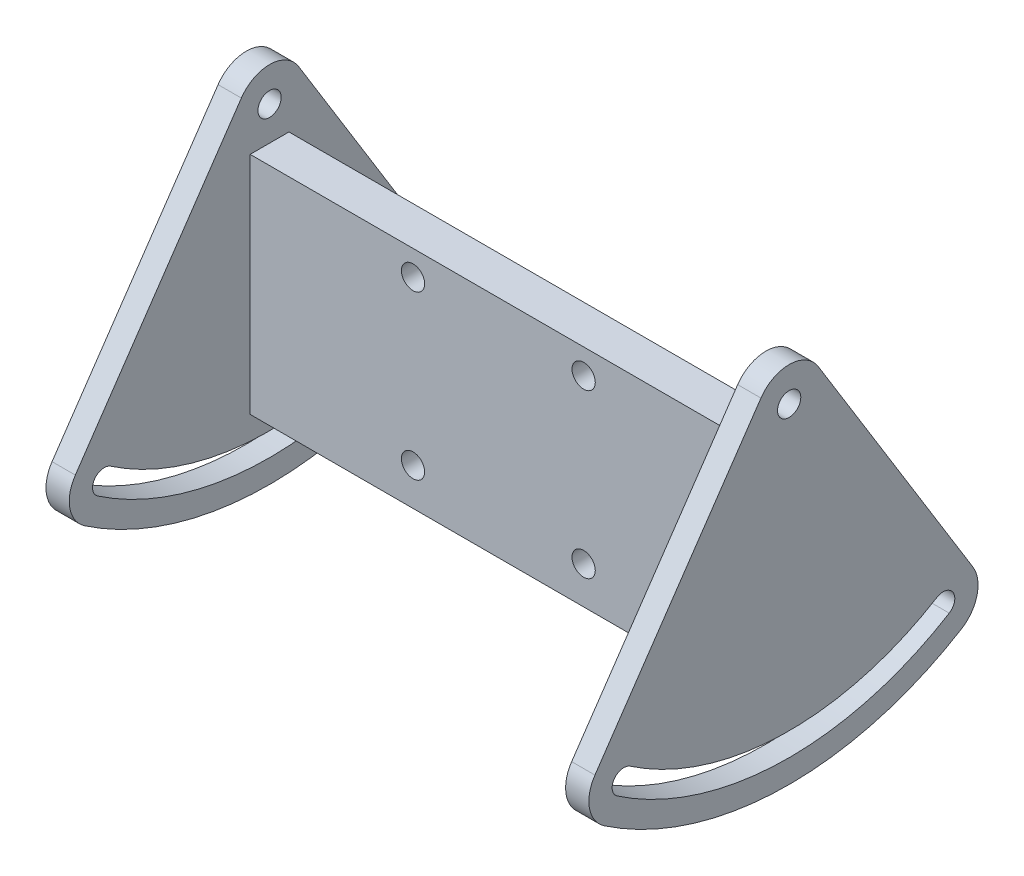
ISO-10303-21;
HEADER;
FILE_DESCRIPTION(('STEP AP214'),'2;1');
FILE_NAME('part.step','',(''),(''),'','','');
FILE_SCHEMA(('AUTOMOTIVE_DESIGN { 1 0 10303 214 1 1 1 1 }'));
ENDSEC;
DATA;
#1=APPLICATION_CONTEXT('core data for automotive mechanical design processes');
#2=APPLICATION_PROTOCOL_DEFINITION('international standard','automotive_design',2000,#1);
#3=PRODUCT_CONTEXT('',#1,'mechanical');
#4=PRODUCT('Part','Part','',(#3));
#5=PRODUCT_RELATED_PRODUCT_CATEGORY('part','',(#4));
#6=PRODUCT_DEFINITION_FORMATION('','',#4);
#7=PRODUCT_DEFINITION_CONTEXT('part definition',#1,'design');
#8=PRODUCT_DEFINITION('design','',#6,#7);
#9=PRODUCT_DEFINITION_SHAPE('','',#8);
#10=(LENGTH_UNIT() NAMED_UNIT(*) SI_UNIT(.MILLI.,.METRE.));
#11=(NAMED_UNIT(*) PLANE_ANGLE_UNIT() SI_UNIT($,.RADIAN.));
#12=(NAMED_UNIT(*) SI_UNIT($,.STERADIAN.) SOLID_ANGLE_UNIT());
#13=UNCERTAINTY_MEASURE_WITH_UNIT(LENGTH_MEASURE(1.E-05),#10,'distance_accuracy_value','');
#14=(GEOMETRIC_REPRESENTATION_CONTEXT(3) GLOBAL_UNCERTAINTY_ASSIGNED_CONTEXT((#13)) GLOBAL_UNIT_ASSIGNED_CONTEXT((#10,
#11,#12)) REPRESENTATION_CONTEXT('',''));
#15=CARTESIAN_POINT('',(0.,0.,0.));
#16=DIRECTION('',(0.,0.,1.));
#17=DIRECTION('',(1.,0.,0.));
#18=AXIS2_PLACEMENT_3D('',#15,#16,#17);
#19=CARTESIAN_POINT('',(70.,11.5202682196495,0.));
#20=DIRECTION('',(-1.,0.,0.));
#21=DIRECTION('',(0.,0.,1.));
#22=AXIS2_PLACEMENT_3D('',#19,#20,#21);
#23=CYLINDRICAL_SURFACE('',#22,42.5);
#24=CARTESIAN_POINT('',(3.,11.5202682196495,0.));
#25=DIRECTION('',(1.,0.,0.));
#26=DIRECTION('',(0.,0.,-1.));
#27=AXIS2_PLACEMENT_3D('',#24,#25,#26);
#28=CIRCLE('',#27,42.5);
#29=CARTESIAN_POINT('',(3.,-23.6557711944979,23.8515460952608));
#30=VERTEX_POINT('',#29);
#31=CARTESIAN_POINT('',(3.,-24.7154249832422,-22.2086590794201));
#32=VERTEX_POINT('',#31);
#33=EDGE_CURVE('E286',#30,#32,#28,.T.);
#34=ORIENTED_EDGE('',*,*,#33,.F.);
#35=DIRECTION('',(-1.,0.,0.));
#36=VECTOR('',#35,1.);
#37=CARTESIAN_POINT('',(70.,-23.6557711944979,23.8515460952608));
#38=LINE('',#37,#36);
#39=CARTESIAN_POINT('',(0.,-23.6557711944979,23.8515460952608));
#40=VERTEX_POINT('',#39);
#41=EDGE_CURVE('E403',#30,#40,#38,.T.);
#42=ORIENTED_EDGE('',*,*,#41,.T.);
#43=CARTESIAN_POINT('',(0.,11.5202682196495,0.));
#44=DIRECTION('',(1.,0.,0.));
#45=DIRECTION('',(0.,0.,-1.));
#46=AXIS2_PLACEMENT_3D('',#43,#44,#45);
#47=CIRCLE('',#46,42.5);
#48=CARTESIAN_POINT('',(0.,-24.7154249832422,-22.2086590794201));
#49=VERTEX_POINT('',#48);
#50=EDGE_CURVE('E368',#40,#49,#47,.T.);
#51=ORIENTED_EDGE('',*,*,#50,.T.);
#52=DIRECTION('',(-1.,0.,0.));
#53=VECTOR('',#52,1.);
#54=CARTESIAN_POINT('',(70.,-24.7154249832422,-22.2086590794201));
#55=LINE('',#54,#53);
#56=EDGE_CURVE('E398',#32,#49,#55,.T.);
#57=ORIENTED_EDGE('',*,*,#56,.F.);
#58=EDGE_LOOP('',(#34,#42,#51,#57));
#59=FACE_BOUND('',#58,.T.);
#60=ADVANCED_FACE('F42',(#59),#23,.T.);
#61=CARTESIAN_POINT('',(70.,11.5202682196495,0.));
#62=DIRECTION('',(-1.,0.,0.));
#63=DIRECTION('',(0.,0.,1.));
#64=AXIS2_PLACEMENT_3D('',#61,#62,#63);
#65=CYLINDRICAL_SURFACE('',#64,39.5);
#66=DIRECTION('',(-1.,0.,0.));
#67=VECTOR('',#66,1.);
#68=CARTESIAN_POINT('',(70.,-21.1727566476169,22.1679075473601));
#69=LINE('',#68,#67);
#70=CARTESIAN_POINT('',(3.,-21.1727566476169,22.1679075473601));
#71=VERTEX_POINT('',#70);
#72=CARTESIAN_POINT('',(0.,-21.1727566476169,22.1679075473601));
#73=VERTEX_POINT('',#72);
#74=EDGE_CURVE('E422',#71,#73,#69,.T.);
#75=ORIENTED_EDGE('',*,*,#74,.F.);
#76=CARTESIAN_POINT('',(3.,11.5202682196495,0.));
#77=DIRECTION('',(1.,0.,0.));
#78=DIRECTION('',(0.,0.,-1.));
#79=AXIS2_PLACEMENT_3D('',#76,#77,#78);
#80=CIRCLE('',#79,39.5);
#81=CARTESIAN_POINT('',(3.,-22.157611345391,-20.6409890267552));
#82=VERTEX_POINT('',#81);
#83=EDGE_CURVE('E296',#71,#82,#80,.T.);
#84=ORIENTED_EDGE('',*,*,#83,.T.);
#85=DIRECTION('',(-1.,0.,0.));
#86=VECTOR('',#85,1.);
#87=CARTESIAN_POINT('',(70.,-22.157611345391,-20.6409890267552));
#88=LINE('',#87,#86);
#89=CARTESIAN_POINT('',(0.,-22.157611345391,-20.6409890267552));
#90=VERTEX_POINT('',#89);
#91=EDGE_CURVE('E427',#82,#90,#88,.T.);
#92=ORIENTED_EDGE('',*,*,#91,.T.);
#93=CARTESIAN_POINT('',(0.,11.5202682196495,0.));
#94=DIRECTION('',(1.,0.,0.));
#95=DIRECTION('',(0.,0.,-1.));
#96=AXIS2_PLACEMENT_3D('',#93,#94,#95);
#97=CIRCLE('',#96,39.5);
#98=EDGE_CURVE('E348',#73,#90,#97,.T.);
#99=ORIENTED_EDGE('',*,*,#98,.F.);
#100=EDGE_LOOP('',(#75,#84,#92,#99));
#101=FACE_BOUND('',#100,.T.);
#102=ADVANCED_FACE('F536',(#101),#65,.F.);
#103=CARTESIAN_POINT('',(70.,11.5202682196495,0.));
#104=DIRECTION('',(-1.,0.,0.));
#105=DIRECTION('',(0.,0.,1.));
#106=AXIS2_PLACEMENT_3D('',#103,#104,#105);
#107=CYLINDRICAL_SURFACE('',#106,36.5);
#108=CARTESIAN_POINT('',(3.,11.5202682196495,0.));
#109=DIRECTION('',(1.,0.,0.));
#110=DIRECTION('',(0.,0.,-1.));
#111=AXIS2_PLACEMENT_3D('',#108,#109,#110);
#112=CIRCLE('',#111,36.5);
#113=CARTESIAN_POINT('',(3.,-18.6897421007359,20.4842689994593));
#114=VERTEX_POINT('',#113);
#115=CARTESIAN_POINT('',(3.,-19.5997977075399,-19.0733189740902));
#116=VERTEX_POINT('',#115);
#117=EDGE_CURVE('E289',#114,#116,#112,.T.);
#118=ORIENTED_EDGE('',*,*,#117,.F.);
#119=DIRECTION('',(-1.,0.,0.));
#120=VECTOR('',#119,1.);
#121=CARTESIAN_POINT('',(70.,-18.6897421007359,20.4842689994593));
#122=LINE('',#121,#120);
#123=CARTESIAN_POINT('',(0.,-18.6897421007359,20.4842689994593));
#124=VERTEX_POINT('',#123);
#125=EDGE_CURVE('E417',#114,#124,#122,.T.);
#126=ORIENTED_EDGE('',*,*,#125,.T.);
#127=CARTESIAN_POINT('',(0.,11.5202682196495,0.));
#128=DIRECTION('',(1.,0.,0.));
#129=DIRECTION('',(0.,0.,-1.));
#130=AXIS2_PLACEMENT_3D('',#127,#128,#129);
#131=CIRCLE('',#130,36.5);
#132=CARTESIAN_POINT('',(0.,-19.5997977075399,-19.0733189740902));
#133=VERTEX_POINT('',#132);
#134=EDGE_CURVE('E356',#124,#133,#131,.T.);
#135=ORIENTED_EDGE('',*,*,#134,.T.);
#136=DIRECTION('',(-1.,0.,0.));
#137=VECTOR('',#136,1.);
#138=CARTESIAN_POINT('',(70.,-19.5997977075399,-19.0733189740902));
#139=LINE('',#138,#137);
#140=EDGE_CURVE('E340',#116,#133,#139,.T.);
#141=ORIENTED_EDGE('',*,*,#140,.F.);
#142=EDGE_LOOP('',(#118,#126,#135,#141));
#143=FACE_BOUND('',#142,.T.);
#144=ADVANCED_FACE('F543',(#143),#107,.T.);
#145=CARTESIAN_POINT('',(70.,11.5202682196495,0.));
#146=DIRECTION('',(-1.,0.,0.));
#147=DIRECTION('',(0.,0.,1.));
#148=AXIS2_PLACEMENT_3D('',#145,#146,#147);
#149=CYLINDRICAL_SURFACE('',#148,4.40353094040779);
#150=CARTESIAN_POINT('',(3.,11.5202682196495,0.));
#151=DIRECTION('',(1.,0.,0.));
#152=DIRECTION('',(0.,0.,-1.));
#153=AXIS2_PLACEMENT_3D('',#150,#151,#152);
#154=CIRCLE('',#153,4.40353094040779);
#155=CARTESIAN_POINT('',(3.,13.830886653745,-3.74861670421858));
#156=VERTEX_POINT('',#155);
#157=CARTESIAN_POINT('',(3.,14.0008309961984,3.63839154774857));
#158=VERTEX_POINT('',#157);
#159=EDGE_CURVE('E11',#156,#158,#154,.T.);
#160=ORIENTED_EDGE('',*,*,#159,.F.);
#161=DIRECTION('',(-1.,0.,0.));
#162=VECTOR('',#161,1.);
#163=CARTESIAN_POINT('',(70.,13.830886653745,-3.74861670421858));
#164=LINE('',#163,#162);
#165=CARTESIAN_POINT('',(0.,13.830886653745,-3.74861670421858));
#166=VERTEX_POINT('',#165);
#167=EDGE_CURVE('E387',#156,#166,#164,.T.);
#168=ORIENTED_EDGE('',*,*,#167,.T.);
#169=CARTESIAN_POINT('',(0.,11.5202682196495,0.));
#170=DIRECTION('',(1.,0.,0.));
#171=DIRECTION('',(0.,0.,-1.));
#172=AXIS2_PLACEMENT_3D('',#169,#170,#171);
#173=CIRCLE('',#172,4.40353094040779);
#174=CARTESIAN_POINT('',(0.,14.0008309961984,3.63839154774857));
#175=VERTEX_POINT('',#174);
#176=EDGE_CURVE('E305',#166,#175,#173,.T.);
#177=ORIENTED_EDGE('',*,*,#176,.T.);
#178=DIRECTION('',(-1.,0.,0.));
#179=VECTOR('',#178,1.);
#180=CARTESIAN_POINT('',(70.,14.0008309961984,3.63839154774857));
#181=LINE('',#180,#179);
#182=EDGE_CURVE('E388',#158,#175,#181,.T.);
#183=ORIENTED_EDGE('',*,*,#182,.F.);
#184=EDGE_LOOP('',(#160,#168,#177,#183));
#185=FACE_BOUND('',#184,.T.);
#186=ADVANCED_FACE('F605',(#185),#149,.T.);
#187=CARTESIAN_POINT('',(70.,11.5202682196495,0.));
#188=DIRECTION('',(-1.,0.,0.));
#189=DIRECTION('',(0.,0.,1.));
#190=AXIS2_PLACEMENT_3D('',#187,#188,#189);
#191=CYLINDRICAL_SURFACE('',#190,1.5);
#192=CARTESIAN_POINT('',(3.,11.5202682196495,0.));
#193=DIRECTION('',(-1.,0.,0.));
#194=DIRECTION('',(0.,-1.,0.));
#195=AXIS2_PLACEMENT_3D('',#192,#193,#194);
#196=CIRCLE('',#195,1.5);
#197=CARTESIAN_POINT('',(3.,10.0202682196495,0.));
#198=VERTEX_POINT('',#197);
#199=EDGE_CURVE('E507',#198,#198,#196,.T.);
#200=ORIENTED_EDGE('',*,*,#199,.F.);
#201=EDGE_LOOP('',(#200));
#202=FACE_BOUND('',#201,.T.);
#203=CARTESIAN_POINT('',(0.,11.5202682196495,0.));
#204=DIRECTION('',(1.,0.,0.));
#205=DIRECTION('',(0.,0.,-1.));
#206=AXIS2_PLACEMENT_3D('',#203,#204,#205);
#207=CIRCLE('',#206,1.5);
#208=CARTESIAN_POINT('',(0.,11.5202682196495,-1.5));
#209=VERTEX_POINT('',#208);
#210=EDGE_CURVE('E299',#209,#209,#207,.T.);
#211=ORIENTED_EDGE('',*,*,#210,.F.);
#212=EDGE_LOOP('',(#211));
#213=FACE_BOUND('',#212,.T.);
#214=ADVANCED_FACE('F597',(#202,#213),#191,.F.);
#215=CARTESIAN_POINT('',(70.,6.13618181985235,9.00030923622076));
#216=DIRECTION('',(0.,-0.5633122169727,-0.826244120226766));
#217=DIRECTION('',(0.,0.826244120226766,-0.5633122169727));
#218=AXIS2_PLACEMENT_3D('',#215,#216,#217);
#219=PLANE('',#218);
#220=DIRECTION('',(0.,-0.826244120226766,0.5633122169727));
#221=VECTOR('',#220,1.);
#222=CARTESIAN_POINT('',(3.,6.13618181985236,9.00030923622075));
#223=LINE('',#222,#221);
#224=CARTESIAN_POINT('',(3.,-17.3963443977993,25.0441868144301));
#225=VERTEX_POINT('',#224);
#226=EDGE_CURVE('E248',#158,#225,#223,.T.);
#227=ORIENTED_EDGE('',*,*,#226,.F.);
#228=ORIENTED_EDGE('',*,*,#182,.T.);
#229=DIRECTION('',(0.,-0.826244120226766,0.5633122169727));
#230=VECTOR('',#229,1.);
#231=CARTESIAN_POINT('',(0.,6.13618181985235,9.00030923622076));
#232=LINE('',#231,#230);
#233=CARTESIAN_POINT('',(0.,-17.3963443977993,25.0441868144301));
#234=VERTEX_POINT('',#233);
#235=EDGE_CURVE('E360',#175,#234,#232,.T.);
#236=ORIENTED_EDGE('',*,*,#235,.T.);
#237=DIRECTION('',(-1.,0.,0.));
#238=VECTOR('',#237,1.);
#239=CARTESIAN_POINT('',(70.,-17.3963443977993,25.0441868144301));
#240=LINE('',#239,#238);
#241=EDGE_CURVE('E408',#225,#234,#240,.T.);
#242=ORIENTED_EDGE('',*,*,#241,.F.);
#243=EDGE_LOOP('',(#227,#228,#236,#242));
#244=FACE_BOUND('',#243,.T.);
#245=ADVANCED_FACE('F884',(#244),#219,.F.);
#246=DIRECTION('',(0.,0.826244120226766,-0.5633122169727));
#247=VECTOR('',#246,1.);
#248=CARTESIAN_POINT('',(67.,6.13618181985235,9.00030923622076));
#249=LINE('',#248,#247);
#250=CARTESIAN_POINT('',(67.,-17.3963443977993,25.0441868144301));
#251=VERTEX_POINT('',#250);
#252=CARTESIAN_POINT('',(67.,14.0008309961984,3.63839154774857));
#253=VERTEX_POINT('',#252);
#254=EDGE_CURVE('E238',#251,#253,#249,.T.);
#255=ORIENTED_EDGE('',*,*,#254,.F.);
#256=CARTESIAN_POINT('',(70.,-17.3963443977993,25.0441868144301));
#257=VERTEX_POINT('',#256);
#258=EDGE_CURVE('E409',#257,#251,#240,.T.);
#259=ORIENTED_EDGE('',*,*,#258,.F.);
#260=DIRECTION('',(0.,-0.826244120226766,0.5633122169727));
#261=VECTOR('',#260,1.);
#262=CARTESIAN_POINT('',(70.,6.13618181985235,9.00030923622076));
#263=LINE('',#262,#261);
#264=CARTESIAN_POINT('',(70.,14.0008309961984,3.63839154774857));
#265=VERTEX_POINT('',#264);
#266=EDGE_CURVE('E320',#265,#257,#263,.T.);
#267=ORIENTED_EDGE('',*,*,#266,.F.);
#268=EDGE_CURVE('E383',#265,#253,#181,.T.);
#269=ORIENTED_EDGE('',*,*,#268,.T.);
#270=EDGE_LOOP('',(#255,#259,#267,#269));
#271=FACE_BOUND('',#270,.T.);
#272=ADVANCED_FACE('F572',(#271),#219,.F.);
#273=CARTESIAN_POINT('',(70.,-19.9312493741764,21.3260882734097));
#274=DIRECTION('',(-1.,0.,0.));
#275=DIRECTION('',(0.,0.,1.));
#276=AXIS2_PLACEMENT_3D('',#273,#274,#275);
#277=CYLINDRICAL_SURFACE('',#276,4.5);
#278=CARTESIAN_POINT('',(3.,-19.9312493741764,21.3260882734097));
#279=DIRECTION('',(1.,0.,0.));
#280=DIRECTION('',(0.,0.,-1.));
#281=AXIS2_PLACEMENT_3D('',#278,#279,#280);
#282=CIRCLE('',#281,4.5);
#283=EDGE_CURVE('E251',#225,#30,#282,.T.);
#284=ORIENTED_EDGE('',*,*,#283,.F.);
#285=ORIENTED_EDGE('',*,*,#241,.T.);
#286=CARTESIAN_POINT('',(0.,-19.9312493741764,21.3260882734097));
#287=DIRECTION('',(1.,0.,0.));
#288=DIRECTION('',(0.,0.,-1.));
#289=AXIS2_PLACEMENT_3D('',#286,#287,#288);
#290=CIRCLE('',#289,4.5);
#291=EDGE_CURVE('E364',#234,#40,#290,.T.);
#292=ORIENTED_EDGE('',*,*,#291,.T.);
#293=ORIENTED_EDGE('',*,*,#41,.F.);
#294=EDGE_LOOP('',(#284,#285,#292,#293));
#295=FACE_BOUND('',#294,.T.);
#296=ADVANCED_FACE('F559',(#295),#277,.T.);
#297=CARTESIAN_POINT('',(67.,-19.9312493741764,21.3260882734097));
#298=DIRECTION('',(-1.,0.,0.));
#299=DIRECTION('',(0.,0.,1.));
#300=AXIS2_PLACEMENT_3D('',#297,#298,#299);
#301=CIRCLE('',#300,4.5);
#302=CARTESIAN_POINT('',(67.,-23.6557711944979,23.8515460952608));
#303=VERTEX_POINT('',#302);
#304=EDGE_CURVE('E241',#303,#251,#301,.T.);
#305=ORIENTED_EDGE('',*,*,#304,.F.);
#306=CARTESIAN_POINT('',(70.,-23.6557711944979,23.8515460952608));
#307=VERTEX_POINT('',#306);
#308=EDGE_CURVE('E404',#307,#303,#38,.T.);
#309=ORIENTED_EDGE('',*,*,#308,.F.);
#310=CARTESIAN_POINT('',(70.,-19.9312493741764,21.3260882734097));
#311=DIRECTION('',(1.,0.,0.));
#312=DIRECTION('',(0.,0.,-1.));
#313=AXIS2_PLACEMENT_3D('',#310,#311,#312);
#314=CIRCLE('',#313,4.5);
#315=EDGE_CURVE('E324',#257,#307,#314,.T.);
#316=ORIENTED_EDGE('',*,*,#315,.F.);
#317=ORIENTED_EDGE('',*,*,#258,.T.);
#318=EDGE_LOOP('',(#305,#309,#316,#317));
#319=FACE_BOUND('',#318,.T.);
#320=ADVANCED_FACE('F551',(#319),#277,.T.);
#321=ORIENTED_EDGE('',*,*,#308,.T.);
#322=CARTESIAN_POINT('',(67.,11.5202682196495,0.));
#323=DIRECTION('',(-1.,0.,0.));
#324=DIRECTION('',(0.,0.,1.));
#325=AXIS2_PLACEMENT_3D('',#322,#323,#324);
#326=CIRCLE('',#325,42.5);
#327=CARTESIAN_POINT('',(67.,-24.7154249832422,-22.2086590794201));
#328=VERTEX_POINT('',#327);
#329=EDGE_CURVE('E266',#328,#303,#326,.T.);
#330=ORIENTED_EDGE('',*,*,#329,.F.);
#331=CARTESIAN_POINT('',(70.,-24.7154249832422,-22.2086590794201));
#332=VERTEX_POINT('',#331);
#333=EDGE_CURVE('E399',#332,#328,#55,.T.);
#334=ORIENTED_EDGE('',*,*,#333,.F.);
#335=CARTESIAN_POINT('',(70.,11.5202682196495,0.));
#336=DIRECTION('',(1.,0.,0.));
#337=DIRECTION('',(0.,0.,-1.));
#338=AXIS2_PLACEMENT_3D('',#335,#336,#337);
#339=CIRCLE('',#338,42.5);
#340=EDGE_CURVE('E327',#307,#332,#339,.T.);
#341=ORIENTED_EDGE('',*,*,#340,.F.);
#342=EDGE_LOOP('',(#321,#330,#334,#341));
#343=FACE_BOUND('',#342,.T.);
#344=ADVANCED_FACE('F539',(#343),#23,.T.);
#345=CARTESIAN_POINT('',(70.,-20.8787045264655,-19.8571540004227));
#346=DIRECTION('',(-1.,0.,0.));
#347=DIRECTION('',(0.,0.,1.));
#348=AXIS2_PLACEMENT_3D('',#345,#346,#347);
#349=CYLINDRICAL_SURFACE('',#348,4.5);
#350=CARTESIAN_POINT('',(3.,-20.8787045264655,-19.8571540004227));
#351=DIRECTION('',(1.,0.,0.));
#352=DIRECTION('',(0.,0.,-1.));
#353=AXIS2_PLACEMENT_3D('',#350,#351,#352);
#354=CIRCLE('',#353,4.5);
#355=CARTESIAN_POINT('',(3.,-18.5174668982663,-23.6878924231262));
#356=VERTEX_POINT('',#355);
#357=EDGE_CURVE('E282',#32,#356,#354,.T.);
#358=ORIENTED_EDGE('',*,*,#357,.F.);
#359=ORIENTED_EDGE('',*,*,#56,.T.);
#360=CARTESIAN_POINT('',(0.,-20.8787045264655,-19.8571540004227));
#361=DIRECTION('',(1.,0.,0.));
#362=DIRECTION('',(0.,0.,-1.));
#363=AXIS2_PLACEMENT_3D('',#360,#361,#362);
#364=CIRCLE('',#363,4.5);
#365=CARTESIAN_POINT('',(0.,-18.5174668982663,-23.6878924231262));
#366=VERTEX_POINT('',#365);
#367=EDGE_CURVE('E372',#49,#366,#364,.T.);
#368=ORIENTED_EDGE('',*,*,#367,.T.);
#369=DIRECTION('',(-1.,0.,0.));
#370=VECTOR('',#369,1.);
#371=CARTESIAN_POINT('',(70.,-18.5174668982663,-23.6878924231262));
#372=LINE('',#371,#370);
#373=EDGE_CURVE('E393',#356,#366,#372,.T.);
#374=ORIENTED_EDGE('',*,*,#373,.F.);
#375=EDGE_LOOP('',(#358,#359,#368,#374));
#376=FACE_BOUND('',#375,.T.);
#377=ADVANCED_FACE('F550',(#376),#349,.T.);
#378=CARTESIAN_POINT('',(67.,-20.8787045264655,-19.8571540004227));
#379=DIRECTION('',(-1.,0.,0.));
#380=DIRECTION('',(0.,0.,1.));
#381=AXIS2_PLACEMENT_3D('',#378,#379,#380);
#382=CIRCLE('',#381,4.5);
#383=CARTESIAN_POINT('',(67.,-18.5174668982663,-23.6878924231262));
#384=VERTEX_POINT('',#383);
#385=EDGE_CURVE('E263',#384,#328,#382,.T.);
#386=ORIENTED_EDGE('',*,*,#385,.F.);
#387=CARTESIAN_POINT('',(70.,-18.5174668982663,-23.6878924231262));
#388=VERTEX_POINT('',#387);
#389=EDGE_CURVE('E394',#388,#384,#372,.T.);
#390=ORIENTED_EDGE('',*,*,#389,.F.);
#391=CARTESIAN_POINT('',(70.,-20.8787045264655,-19.8571540004227));
#392=DIRECTION('',(1.,0.,0.));
#393=DIRECTION('',(0.,0.,-1.));
#394=AXIS2_PLACEMENT_3D('',#391,#392,#393);
#395=CIRCLE('',#394,4.5);
#396=EDGE_CURVE('E330',#332,#388,#395,.T.);
#397=ORIENTED_EDGE('',*,*,#396,.F.);
#398=ORIENTED_EDGE('',*,*,#333,.T.);
#399=EDGE_LOOP('',(#386,#390,#397,#398));
#400=FACE_BOUND('',#399,.T.);
#401=ADVANCED_FACE('F557',(#400),#349,.T.);
#402=CARTESIAN_POINT('',(70.,5.48249993432314,-8.89449791078369));
#403=DIRECTION('',(0.,0.524719472933136,-0.851275205045214));
#404=DIRECTION('',(0.,0.851275205045214,0.524719472933136));
#405=AXIS2_PLACEMENT_3D('',#402,#403,#404);
#406=PLANE('',#405);
#407=ORIENTED_EDGE('',*,*,#167,.F.);
#408=DIRECTION('',(0.,-0.851275205045214,-0.524719472933136));
#409=VECTOR('',#408,1.);
#410=CARTESIAN_POINT('',(3.,5.48249993432314,-8.89449791078369));
#411=LINE('',#410,#409);
#412=EDGE_CURVE('E279',#156,#356,#411,.T.);
#413=ORIENTED_EDGE('',*,*,#412,.T.);
#414=ORIENTED_EDGE('',*,*,#373,.T.);
#415=DIRECTION('',(0.,-0.851275205045214,-0.524719472933136));
#416=VECTOR('',#415,1.);
#417=CARTESIAN_POINT('',(0.,5.48249993432314,-8.89449791078369));
#418=LINE('',#417,#416);
#419=EDGE_CURVE('E376',#166,#366,#418,.T.);
#420=ORIENTED_EDGE('',*,*,#419,.F.);
#421=EDGE_LOOP('',(#407,#413,#414,#420));
#422=FACE_BOUND('',#421,.T.);
#423=ADVANCED_FACE('F606',(#422),#406,.T.);
#424=ORIENTED_EDGE('',*,*,#389,.T.);
#425=DIRECTION('',(0.,0.851275205045214,0.524719472933136));
#426=VECTOR('',#425,1.);
#427=CARTESIAN_POINT('',(67.,5.48249993432314,-8.89449791078369));
#428=LINE('',#427,#426);
#429=CARTESIAN_POINT('',(67.,13.830886653745,-3.74861670421858));
#430=VERTEX_POINT('',#429);
#431=EDGE_CURVE('E259',#384,#430,#428,.T.);
#432=ORIENTED_EDGE('',*,*,#431,.T.);
#433=CARTESIAN_POINT('',(70.,13.830886653745,-3.74861670421858));
#434=VERTEX_POINT('',#433);
#435=EDGE_CURVE('E389',#434,#430,#164,.T.);
#436=ORIENTED_EDGE('',*,*,#435,.F.);
#437=DIRECTION('',(0.,-0.851275205045214,-0.524719472933136));
#438=VECTOR('',#437,1.);
#439=CARTESIAN_POINT('',(70.,5.48249993432314,-8.89449791078369));
#440=LINE('',#439,#438);
#441=EDGE_CURVE('E333',#434,#388,#440,.T.);
#442=ORIENTED_EDGE('',*,*,#441,.T.);
#443=EDGE_LOOP('',(#424,#432,#436,#442));
#444=FACE_BOUND('',#443,.T.);
#445=ADVANCED_FACE('F581',(#444),#406,.T.);
#446=CARTESIAN_POINT('',(70.,-20.8787045264655,-19.8571540004227));
#447=DIRECTION('',(-1.,0.,0.));
#448=DIRECTION('',(0.,0.,1.));
#449=AXIS2_PLACEMENT_3D('',#446,#447,#448);
#450=CYLINDRICAL_SURFACE('',#449,1.5);
#451=ORIENTED_EDGE('',*,*,#91,.F.);
#452=CARTESIAN_POINT('',(3.,-20.8787045264655,-19.8571540004227));
#453=DIRECTION('',(1.,0.,0.));
#454=DIRECTION('',(0.,0.,-1.));
#455=AXIS2_PLACEMENT_3D('',#452,#453,#454);
#456=CIRCLE('',#455,1.5);
#457=EDGE_CURVE('E292',#82,#116,#456,.T.);
#458=ORIENTED_EDGE('',*,*,#457,.T.);
#459=ORIENTED_EDGE('',*,*,#140,.T.);
#460=CARTESIAN_POINT('',(0.,-20.8787045264655,-19.8571540004227));
#461=DIRECTION('',(1.,0.,0.));
#462=DIRECTION('',(0.,0.,-1.));
#463=AXIS2_PLACEMENT_3D('',#460,#461,#462);
#464=CIRCLE('',#463,1.5);
#465=EDGE_CURVE('E344',#90,#133,#464,.T.);
#466=ORIENTED_EDGE('',*,*,#465,.F.);
#467=EDGE_LOOP('',(#451,#458,#459,#466));
#468=FACE_BOUND('',#467,.T.);
#469=ADVANCED_FACE('F613',(#468),#450,.F.);
#470=CARTESIAN_POINT('',(70.,-19.5997977075399,-19.0733189740902));
#471=VERTEX_POINT('',#470);
#472=CARTESIAN_POINT('',(67.,-19.5997977075399,-19.0733189740902));
#473=VERTEX_POINT('',#472);
#474=EDGE_CURVE('E413',#471,#473,#139,.T.);
#475=ORIENTED_EDGE('',*,*,#474,.T.);
#476=CARTESIAN_POINT('',(67.,-20.8787045264655,-19.8571540004227));
#477=DIRECTION('',(-1.,0.,0.));
#478=DIRECTION('',(0.,0.,1.));
#479=AXIS2_PLACEMENT_3D('',#476,#477,#478);
#480=CIRCLE('',#479,1.5);
#481=CARTESIAN_POINT('',(67.,-22.157611345391,-20.6409890267552));
#482=VERTEX_POINT('',#481);
#483=EDGE_CURVE('E272',#473,#482,#480,.T.);
#484=ORIENTED_EDGE('',*,*,#483,.T.);
#485=CARTESIAN_POINT('',(70.,-22.157611345391,-20.6409890267552));
#486=VERTEX_POINT('',#485);
#487=EDGE_CURVE('E428',#486,#482,#88,.T.);
#488=ORIENTED_EDGE('',*,*,#487,.F.);
#489=CARTESIAN_POINT('',(70.,-20.8787045264655,-19.8571540004227));
#490=DIRECTION('',(1.,0.,0.));
#491=DIRECTION('',(0.,0.,-1.));
#492=AXIS2_PLACEMENT_3D('',#489,#490,#491);
#493=CIRCLE('',#492,1.5);
#494=EDGE_CURVE('E304',#486,#471,#493,.T.);
#495=ORIENTED_EDGE('',*,*,#494,.T.);
#496=EDGE_LOOP('',(#475,#484,#488,#495));
#497=FACE_BOUND('',#496,.T.);
#498=ADVANCED_FACE('F704',(#497),#450,.F.);
#499=CARTESIAN_POINT('',(67.,11.5202682196495,0.));
#500=DIRECTION('',(-1.,0.,0.));
#501=DIRECTION('',(0.,0.,1.));
#502=AXIS2_PLACEMENT_3D('',#499,#500,#501);
#503=CIRCLE('',#502,39.5);
#504=CARTESIAN_POINT('',(67.,-21.1727566476169,22.1679075473601));
#505=VERTEX_POINT('',#504);
#506=EDGE_CURVE('E276',#482,#505,#503,.T.);
#507=ORIENTED_EDGE('',*,*,#506,.T.);
#508=CARTESIAN_POINT('',(70.,-21.1727566476169,22.1679075473601));
#509=VERTEX_POINT('',#508);
#510=EDGE_CURVE('E423',#509,#505,#69,.T.);
#511=ORIENTED_EDGE('',*,*,#510,.F.);
#512=CARTESIAN_POINT('',(70.,11.5202682196495,0.));
#513=DIRECTION('',(1.,0.,0.));
#514=DIRECTION('',(0.,0.,-1.));
#515=AXIS2_PLACEMENT_3D('',#512,#513,#514);
#516=CIRCLE('',#515,39.5);
#517=EDGE_CURVE('E309',#509,#486,#516,.T.);
#518=ORIENTED_EDGE('',*,*,#517,.T.);
#519=ORIENTED_EDGE('',*,*,#487,.T.);
#520=EDGE_LOOP('',(#507,#511,#518,#519));
#521=FACE_BOUND('',#520,.T.);
#522=ADVANCED_FACE('F546',(#521),#65,.F.);
#523=CARTESIAN_POINT('',(70.,-19.9312493741764,21.3260882734097));
#524=DIRECTION('',(-1.,0.,0.));
#525=DIRECTION('',(0.,0.,1.));
#526=AXIS2_PLACEMENT_3D('',#523,#524,#525);
#527=CYLINDRICAL_SURFACE('',#526,1.5);
#528=ORIENTED_EDGE('',*,*,#125,.F.);
#529=CARTESIAN_POINT('',(3.,-19.9312493741764,21.3260882734097));
#530=DIRECTION('',(1.,0.,0.));
#531=DIRECTION('',(0.,0.,-1.));
#532=AXIS2_PLACEMENT_3D('',#529,#530,#531);
#533=CIRCLE('',#532,1.5);
#534=EDGE_CURVE('E255',#114,#71,#533,.T.);
#535=ORIENTED_EDGE('',*,*,#534,.T.);
#536=ORIENTED_EDGE('',*,*,#74,.T.);
#537=CARTESIAN_POINT('',(0.,-19.9312493741764,21.3260882734097));
#538=DIRECTION('',(1.,0.,0.));
#539=DIRECTION('',(0.,0.,-1.));
#540=AXIS2_PLACEMENT_3D('',#537,#538,#539);
#541=CIRCLE('',#540,1.5);
#542=EDGE_CURVE('E352',#124,#73,#541,.T.);
#543=ORIENTED_EDGE('',*,*,#542,.F.);
#544=EDGE_LOOP('',(#528,#535,#536,#543));
#545=FACE_BOUND('',#544,.T.);
#546=ADVANCED_FACE('F695',(#545),#527,.F.);
#547=ORIENTED_EDGE('',*,*,#510,.T.);
#548=CARTESIAN_POINT('',(67.,-19.9312493741764,21.3260882734097));
#549=DIRECTION('',(-1.,0.,0.));
#550=DIRECTION('',(0.,0.,1.));
#551=AXIS2_PLACEMENT_3D('',#548,#549,#550);
#552=CIRCLE('',#551,1.5);
#553=CARTESIAN_POINT('',(67.,-18.6897421007359,20.4842689994593));
#554=VERTEX_POINT('',#553);
#555=EDGE_CURVE('E244',#505,#554,#552,.T.);
#556=ORIENTED_EDGE('',*,*,#555,.T.);
#557=CARTESIAN_POINT('',(70.,-18.6897421007359,20.4842689994593));
#558=VERTEX_POINT('',#557);
#559=EDGE_CURVE('E418',#558,#554,#122,.T.);
#560=ORIENTED_EDGE('',*,*,#559,.F.);
#561=CARTESIAN_POINT('',(70.,-19.9312493741764,21.3260882734097));
#562=DIRECTION('',(1.,0.,0.));
#563=DIRECTION('',(0.,0.,-1.));
#564=AXIS2_PLACEMENT_3D('',#561,#562,#563);
#565=CIRCLE('',#564,1.5);
#566=EDGE_CURVE('E313',#558,#509,#565,.T.);
#567=ORIENTED_EDGE('',*,*,#566,.T.);
#568=EDGE_LOOP('',(#547,#556,#560,#567));
#569=FACE_BOUND('',#568,.T.);
#570=ADVANCED_FACE('F697',(#569),#527,.F.);
#571=ORIENTED_EDGE('',*,*,#559,.T.);
#572=CARTESIAN_POINT('',(67.,11.5202682196495,0.));
#573=DIRECTION('',(-1.,0.,0.));
#574=DIRECTION('',(0.,0.,1.));
#575=AXIS2_PLACEMENT_3D('',#572,#573,#574);
#576=CIRCLE('',#575,36.5);
#577=EDGE_CURVE('E269',#473,#554,#576,.T.);
#578=ORIENTED_EDGE('',*,*,#577,.F.);
#579=ORIENTED_EDGE('',*,*,#474,.F.);
#580=CARTESIAN_POINT('',(70.,11.5202682196495,0.));
#581=DIRECTION('',(1.,0.,0.));
#582=DIRECTION('',(0.,0.,-1.));
#583=AXIS2_PLACEMENT_3D('',#580,#581,#582);
#584=CIRCLE('',#583,36.5);
#585=EDGE_CURVE('E317',#558,#471,#584,.T.);
#586=ORIENTED_EDGE('',*,*,#585,.F.);
#587=EDGE_LOOP('',(#571,#578,#579,#586));
#588=FACE_BOUND('',#587,.T.);
#589=ADVANCED_FACE('F604',(#588),#107,.T.);
#590=ORIENTED_EDGE('',*,*,#435,.T.);
#591=CARTESIAN_POINT('',(67.,11.5202682196495,0.));
#592=DIRECTION('',(-1.,0.,0.));
#593=DIRECTION('',(0.,0.,1.));
#594=AXIS2_PLACEMENT_3D('',#591,#592,#593);
#595=CIRCLE('',#594,4.40353094040779);
#596=EDGE_CURVE('E52',#253,#430,#595,.T.);
#597=ORIENTED_EDGE('',*,*,#596,.F.);
#598=ORIENTED_EDGE('',*,*,#268,.F.);
#599=CARTESIAN_POINT('',(70.,11.5202682196495,0.));
#600=DIRECTION('',(1.,0.,0.));
#601=DIRECTION('',(0.,0.,-1.));
#602=AXIS2_PLACEMENT_3D('',#599,#600,#601);
#603=CIRCLE('',#602,4.40353094040779);
#604=EDGE_CURVE('E337',#434,#265,#603,.T.);
#605=ORIENTED_EDGE('',*,*,#604,.F.);
#606=EDGE_LOOP('',(#590,#597,#598,#605));
#607=FACE_BOUND('',#606,.T.);
#608=ADVANCED_FACE('F577',(#607),#149,.T.);
#609=CARTESIAN_POINT('',(67.,11.5202682196495,0.));
#610=DIRECTION('',(1.,0.,0.));
#611=DIRECTION('',(0.,0.,-1.));
#612=AXIS2_PLACEMENT_3D('',#609,#610,#611);
#613=CIRCLE('',#612,1.5);
#614=CARTESIAN_POINT('',(67.,11.5202682196495,-1.5));
#615=VERTEX_POINT('',#614);
#616=EDGE_CURVE('E500',#615,#615,#613,.T.);
#617=ORIENTED_EDGE('',*,*,#616,.F.);
#618=EDGE_LOOP('',(#617));
#619=FACE_BOUND('',#618,.T.);
#620=CARTESIAN_POINT('',(70.,11.5202682196495,0.));
#621=DIRECTION('',(1.,0.,0.));
#622=DIRECTION('',(0.,0.,-1.));
#623=AXIS2_PLACEMENT_3D('',#620,#621,#622);
#624=CIRCLE('',#623,1.5);
#625=CARTESIAN_POINT('',(70.,11.5202682196495,-1.5));
#626=VERTEX_POINT('',#625);
#627=EDGE_CURVE('E300',#626,#626,#624,.T.);
#628=ORIENTED_EDGE('',*,*,#627,.T.);
#629=EDGE_LOOP('',(#628));
#630=FACE_BOUND('',#629,.T.);
#631=ADVANCED_FACE('F44',(#619,#630),#191,.F.);
#632=CARTESIAN_POINT('',(70.,0.,0.));
#633=DIRECTION('',(1.,0.,0.));
#634=DIRECTION('',(0.,0.,-1.));
#635=AXIS2_PLACEMENT_3D('',#632,#633,#634);
#636=PLANE('',#635);
#637=ORIENTED_EDGE('',*,*,#627,.F.);
#638=EDGE_LOOP('',(#637));
#639=FACE_BOUND('',#638,.T.);
#640=ORIENTED_EDGE('',*,*,#494,.F.);
#641=ORIENTED_EDGE('',*,*,#517,.F.);
#642=ORIENTED_EDGE('',*,*,#566,.F.);
#643=ORIENTED_EDGE('',*,*,#585,.T.);
#644=EDGE_LOOP('',(#640,#641,#642,#643));
#645=FACE_BOUND('',#644,.T.);
#646=ORIENTED_EDGE('',*,*,#266,.T.);
#647=ORIENTED_EDGE('',*,*,#315,.T.);
#648=ORIENTED_EDGE('',*,*,#340,.T.);
#649=ORIENTED_EDGE('',*,*,#396,.T.);
#650=ORIENTED_EDGE('',*,*,#441,.F.);
#651=ORIENTED_EDGE('',*,*,#604,.T.);
#652=EDGE_LOOP('',(#646,#647,#648,#649,#650,#651));
#653=FACE_BOUND('',#652,.T.);
#654=ADVANCED_FACE('F586',(#639,#645,#653),#636,.T.);
#655=CARTESIAN_POINT('',(0.,0.,0.));
#656=DIRECTION('',(1.,0.,0.));
#657=DIRECTION('',(0.,0.,-1.));
#658=AXIS2_PLACEMENT_3D('',#655,#656,#657);
#659=PLANE('',#658);
#660=ORIENTED_EDGE('',*,*,#210,.T.);
#661=EDGE_LOOP('',(#660));
#662=FACE_BOUND('',#661,.T.);
#663=ORIENTED_EDGE('',*,*,#465,.T.);
#664=ORIENTED_EDGE('',*,*,#134,.F.);
#665=ORIENTED_EDGE('',*,*,#542,.T.);
#666=ORIENTED_EDGE('',*,*,#98,.T.);
#667=EDGE_LOOP('',(#663,#664,#665,#666));
#668=FACE_BOUND('',#667,.T.);
#669=ORIENTED_EDGE('',*,*,#235,.F.);
#670=ORIENTED_EDGE('',*,*,#176,.F.);
#671=ORIENTED_EDGE('',*,*,#419,.T.);
#672=ORIENTED_EDGE('',*,*,#367,.F.);
#673=ORIENTED_EDGE('',*,*,#50,.F.);
#674=ORIENTED_EDGE('',*,*,#291,.F.);
#675=EDGE_LOOP('',(#669,#670,#671,#672,#673,#674));
#676=FACE_BOUND('',#675,.T.);
#677=ADVANCED_FACE('F521',(#662,#668,#676),#659,.F.);
#678=CARTESIAN_POINT('',(3.,40.,2.5));
#679=DIRECTION('',(0.,0.,1.));
#680=DIRECTION('',(1.,0.,0.));
#681=AXIS2_PLACEMENT_3D('',#678,#679,#680);
#682=PLANE('',#681);
#683=DIRECTION('',(-1.,0.,0.));
#684=VECTOR('',#683,1.);
#685=CARTESIAN_POINT('',(3.,-21.8940146924168,2.5));
#686=LINE('',#685,#684);
#687=CARTESIAN_POINT('',(67.,-21.8940146924168,2.5));
#688=VERTEX_POINT('',#687);
#689=CARTESIAN_POINT('',(3.,-21.8940146924168,2.5));
#690=VERTEX_POINT('',#689);
#691=EDGE_CURVE('E226',#688,#690,#686,.T.);
#692=ORIENTED_EDGE('',*,*,#691,.F.);
#693=DIRECTION('',(0.,-1.,0.));
#694=VECTOR('',#693,1.);
#695=CARTESIAN_POINT('',(67.,40.,2.5));
#696=LINE('',#695,#694);
#697=CARTESIAN_POINT('',(67.,7.14533163194015,2.5));
#698=VERTEX_POINT('',#697);
#699=EDGE_CURVE('E218',#698,#688,#696,.T.);
#700=ORIENTED_EDGE('',*,*,#699,.F.);
#701=DIRECTION('',(1.,0.,0.));
#702=VECTOR('',#701,1.);
#703=CARTESIAN_POINT('',(3.,7.14533163194015,2.5));
#704=LINE('',#703,#702);
#705=CARTESIAN_POINT('',(3.,7.14533163194015,2.5));
#706=VERTEX_POINT('',#705);
#707=EDGE_CURVE('E204',#706,#698,#704,.T.);
#708=ORIENTED_EDGE('',*,*,#707,.F.);
#709=DIRECTION('',(0.,-1.,0.));
#710=VECTOR('',#709,1.);
#711=CARTESIAN_POINT('',(3.,40.,2.5));
#712=LINE('',#711,#710);
#713=EDGE_CURVE('E228',#706,#690,#712,.T.);
#714=ORIENTED_EDGE('',*,*,#713,.T.);
#715=EDGE_LOOP('',(#692,#700,#708,#714));
#716=FACE_BOUND('',#715,.T.);
#717=CARTESIAN_POINT('',(24.,-17.0762008399428,2.5));
#718=DIRECTION('',(0.,0.,1.));
#719=DIRECTION('',(1.,0.,0.));
#720=AXIS2_PLACEMENT_3D('',#717,#718,#719);
#721=CIRCLE('',#720,1.5);
#722=CARTESIAN_POINT('',(25.5,-17.0762008399428,2.5));
#723=VERTEX_POINT('',#722);
#724=EDGE_CURVE('E484',#723,#723,#721,.T.);
#725=ORIENTED_EDGE('',*,*,#724,.F.);
#726=EDGE_LOOP('',(#725));
#727=FACE_BOUND('',#726,.T.);
#728=CARTESIAN_POINT('',(46.,-17.0762008399428,2.5));
#729=DIRECTION('',(0.,0.,1.));
#730=DIRECTION('',(1.,0.,0.));
#731=AXIS2_PLACEMENT_3D('',#728,#729,#730);
#732=CIRCLE('',#731,1.50000000000001);
#733=CARTESIAN_POINT('',(47.5,-17.0762008399428,2.5));
#734=VERTEX_POINT('',#733);
#735=EDGE_CURVE('E481',#734,#734,#732,.T.);
#736=ORIENTED_EDGE('',*,*,#735,.F.);
#737=EDGE_LOOP('',(#736));
#738=FACE_BOUND('',#737,.T.);
#739=CARTESIAN_POINT('',(46.,3.92379916005724,2.5));
#740=DIRECTION('',(0.,0.,1.));
#741=DIRECTION('',(1.,0.,0.));
#742=AXIS2_PLACEMENT_3D('',#739,#740,#741);
#743=CIRCLE('',#742,1.5);
#744=CARTESIAN_POINT('',(47.5,3.92379916005724,2.5));
#745=VERTEX_POINT('',#744);
#746=EDGE_CURVE('E476',#745,#745,#743,.T.);
#747=ORIENTED_EDGE('',*,*,#746,.F.);
#748=EDGE_LOOP('',(#747));
#749=FACE_BOUND('',#748,.T.);
#750=CARTESIAN_POINT('',(24.,3.92379916005724,2.5));
#751=DIRECTION('',(0.,0.,1.));
#752=DIRECTION('',(1.,0.,0.));
#753=AXIS2_PLACEMENT_3D('',#750,#751,#752);
#754=CIRCLE('',#753,1.5);
#755=CARTESIAN_POINT('',(25.5,3.92379916005724,2.5));
#756=VERTEX_POINT('',#755);
#757=EDGE_CURVE('E439',#756,#756,#754,.T.);
#758=ORIENTED_EDGE('',*,*,#757,.F.);
#759=EDGE_LOOP('',(#758));
#760=FACE_BOUND('',#759,.T.);
#761=ADVANCED_FACE('F224',(#716,#727,#738,#749,#760),#682,.T.);
#762=CARTESIAN_POINT('',(3.,40.,-32.5));
#763=DIRECTION('',(1.,0.,0.));
#764=DIRECTION('',(0.,0.,-1.));
#765=AXIS2_PLACEMENT_3D('',#762,#763,#764);
#766=PLANE('',#765);
#767=ORIENTED_EDGE('',*,*,#534,.F.);
#768=ORIENTED_EDGE('',*,*,#117,.T.);
#769=ORIENTED_EDGE('',*,*,#457,.F.);
#770=ORIENTED_EDGE('',*,*,#83,.F.);
#771=EDGE_LOOP('',(#767,#768,#769,#770));
#772=FACE_BOUND('',#771,.T.);
#773=ORIENTED_EDGE('',*,*,#283,.T.);
#774=ORIENTED_EDGE('',*,*,#33,.T.);
#775=ORIENTED_EDGE('',*,*,#357,.T.);
#776=ORIENTED_EDGE('',*,*,#412,.F.);
#777=ORIENTED_EDGE('',*,*,#159,.T.);
#778=ORIENTED_EDGE('',*,*,#226,.T.);
#779=EDGE_LOOP('',(#773,#774,#775,#776,#777,#778));
#780=FACE_BOUND('',#779,.T.);
#781=DIRECTION('',(0.,-1.,0.));
#782=VECTOR('',#781,1.);
#783=CARTESIAN_POINT('',(3.,40.,-2.5));
#784=LINE('',#783,#782);
#785=CARTESIAN_POINT('',(3.,7.14533163194015,-2.5));
#786=VERTEX_POINT('',#785);
#787=CARTESIAN_POINT('',(3.,-21.8940146924168,-2.5));
#788=VERTEX_POINT('',#787);
#789=EDGE_CURVE('E233',#786,#788,#784,.T.);
#790=ORIENTED_EDGE('',*,*,#789,.T.);
#791=DIRECTION('',(0.,0.,1.));
#792=VECTOR('',#791,1.);
#793=CARTESIAN_POINT('',(3.,-21.8940146924168,-8.5));
#794=LINE('',#793,#792);
#795=EDGE_CURVE('E493',#788,#690,#794,.T.);
#796=ORIENTED_EDGE('',*,*,#795,.T.);
#797=ORIENTED_EDGE('',*,*,#713,.F.);
#798=DIRECTION('',(0.,0.,1.));
#799=VECTOR('',#798,1.);
#800=CARTESIAN_POINT('',(3.,7.14533163194015,-8.5));
#801=LINE('',#800,#799);
#802=EDGE_CURVE('E207',#786,#706,#801,.T.);
#803=ORIENTED_EDGE('',*,*,#802,.F.);
#804=EDGE_LOOP('',(#790,#796,#797,#803));
#805=FACE_BOUND('',#804,.T.);
#806=ORIENTED_EDGE('',*,*,#199,.T.);
#807=EDGE_LOOP('',(#806));
#808=FACE_BOUND('',#807,.T.);
#809=ADVANCED_FACE('F459',(#772,#780,#805,#808),#766,.T.);
#810=CARTESIAN_POINT('',(3.,40.,-2.5));
#811=DIRECTION('',(0.,0.,-1.));
#812=DIRECTION('',(-1.,0.,0.));
#813=AXIS2_PLACEMENT_3D('',#810,#811,#812);
#814=PLANE('',#813);
#815=DIRECTION('',(1.,0.,0.));
#816=VECTOR('',#815,1.);
#817=CARTESIAN_POINT('',(3.,-21.8940146924168,-2.5));
#818=LINE('',#817,#816);
#819=CARTESIAN_POINT('',(67.,-21.8940146924168,-2.5));
#820=VERTEX_POINT('',#819);
#821=EDGE_CURVE('E213',#788,#820,#818,.T.);
#822=ORIENTED_EDGE('',*,*,#821,.F.);
#823=ORIENTED_EDGE('',*,*,#789,.F.);
#824=DIRECTION('',(-1.,0.,0.));
#825=VECTOR('',#824,1.);
#826=CARTESIAN_POINT('',(3.,7.14533163194015,-2.5));
#827=LINE('',#826,#825);
#828=CARTESIAN_POINT('',(67.,7.14533163194015,-2.5));
#829=VERTEX_POINT('',#828);
#830=EDGE_CURVE('E214',#829,#786,#827,.T.);
#831=ORIENTED_EDGE('',*,*,#830,.F.);
#832=DIRECTION('',(0.,-1.,0.));
#833=VECTOR('',#832,1.);
#834=CARTESIAN_POINT('',(67.,40.,-2.5));
#835=LINE('',#834,#833);
#836=EDGE_CURVE('E220',#829,#820,#835,.T.);
#837=ORIENTED_EDGE('',*,*,#836,.T.);
#838=EDGE_LOOP('',(#822,#823,#831,#837));
#839=FACE_BOUND('',#838,.T.);
#840=CARTESIAN_POINT('',(24.,-17.0762008399428,-2.5));
#841=DIRECTION('',(0.,0.,-1.));
#842=DIRECTION('',(-1.,0.,0.));
#843=AXIS2_PLACEMENT_3D('',#840,#841,#842);
#844=CIRCLE('',#843,1.5);
#845=CARTESIAN_POINT('',(22.5,-17.0762008399428,-2.5));
#846=VERTEX_POINT('',#845);
#847=EDGE_CURVE('E46',#846,#846,#844,.T.);
#848=ORIENTED_EDGE('',*,*,#847,.F.);
#849=EDGE_LOOP('',(#848));
#850=FACE_BOUND('',#849,.T.);
#851=CARTESIAN_POINT('',(46.,-17.0762008399428,-2.5));
#852=DIRECTION('',(0.,0.,-1.));
#853=DIRECTION('',(-1.,0.,0.));
#854=AXIS2_PLACEMENT_3D('',#851,#852,#853);
#855=CIRCLE('',#854,1.50000000000001);
#856=CARTESIAN_POINT('',(44.5,-17.0762008399428,-2.5));
#857=VERTEX_POINT('',#856);
#858=EDGE_CURVE('E442',#857,#857,#855,.T.);
#859=ORIENTED_EDGE('',*,*,#858,.F.);
#860=EDGE_LOOP('',(#859));
#861=FACE_BOUND('',#860,.T.);
#862=CARTESIAN_POINT('',(46.,3.92379916005724,-2.5));
#863=DIRECTION('',(0.,0.,-1.));
#864=DIRECTION('',(-1.,0.,0.));
#865=AXIS2_PLACEMENT_3D('',#862,#863,#864);
#866=CIRCLE('',#865,1.5);
#867=CARTESIAN_POINT('',(44.5,3.92379916005724,-2.5));
#868=VERTEX_POINT('',#867);
#869=EDGE_CURVE('E438',#868,#868,#866,.T.);
#870=ORIENTED_EDGE('',*,*,#869,.F.);
#871=EDGE_LOOP('',(#870));
#872=FACE_BOUND('',#871,.T.);
#873=CARTESIAN_POINT('',(24.,3.92379916005724,-2.5));
#874=DIRECTION('',(0.,0.,-1.));
#875=DIRECTION('',(-1.,0.,0.));
#876=AXIS2_PLACEMENT_3D('',#873,#874,#875);
#877=CIRCLE('',#876,1.5);
#878=CARTESIAN_POINT('',(22.5,3.92379916005724,-2.5));
#879=VERTEX_POINT('',#878);
#880=EDGE_CURVE('E434',#879,#879,#877,.T.);
#881=ORIENTED_EDGE('',*,*,#880,.F.);
#882=EDGE_LOOP('',(#881));
#883=FACE_BOUND('',#882,.T.);
#884=ADVANCED_FACE('F456',(#839,#850,#861,#872,#883),#814,.T.);
#885=CARTESIAN_POINT('',(67.,40.,-2.5));
#886=DIRECTION('',(-1.,0.,0.));
#887=DIRECTION('',(0.,0.,1.));
#888=AXIS2_PLACEMENT_3D('',#885,#886,#887);
#889=PLANE('',#888);
#890=ORIENTED_EDGE('',*,*,#699,.T.);
#891=DIRECTION('',(0.,0.,1.));
#892=VECTOR('',#891,1.);
#893=CARTESIAN_POINT('',(67.,-21.8940146924168,-8.5));
#894=LINE('',#893,#892);
#895=EDGE_CURVE('E60',#820,#688,#894,.T.);
#896=ORIENTED_EDGE('',*,*,#895,.F.);
#897=ORIENTED_EDGE('',*,*,#836,.F.);
#898=DIRECTION('',(0.,0.,1.));
#899=VECTOR('',#898,1.);
#900=CARTESIAN_POINT('',(67.,7.14533163194015,-8.5));
#901=LINE('',#900,#899);
#902=EDGE_CURVE('E68',#829,#698,#901,.T.);
#903=ORIENTED_EDGE('',*,*,#902,.T.);
#904=EDGE_LOOP('',(#890,#896,#897,#903));
#905=FACE_BOUND('',#904,.T.);
#906=ORIENTED_EDGE('',*,*,#555,.F.);
#907=ORIENTED_EDGE('',*,*,#506,.F.);
#908=ORIENTED_EDGE('',*,*,#483,.F.);
#909=ORIENTED_EDGE('',*,*,#577,.T.);
#910=EDGE_LOOP('',(#906,#907,#908,#909));
#911=FACE_BOUND('',#910,.T.);
#912=ORIENTED_EDGE('',*,*,#329,.T.);
#913=ORIENTED_EDGE('',*,*,#304,.T.);
#914=ORIENTED_EDGE('',*,*,#254,.T.);
#915=ORIENTED_EDGE('',*,*,#596,.T.);
#916=ORIENTED_EDGE('',*,*,#431,.F.);
#917=ORIENTED_EDGE('',*,*,#385,.T.);
#918=EDGE_LOOP('',(#912,#913,#914,#915,#916,#917));
#919=FACE_BOUND('',#918,.T.);
#920=ORIENTED_EDGE('',*,*,#616,.T.);
#921=EDGE_LOOP('',(#920));
#922=FACE_BOUND('',#921,.T.);
#923=ADVANCED_FACE('F216',(#905,#911,#919,#922),#889,.T.);
#924=CARTESIAN_POINT('',(24.,3.92379916005724,-7.5));
#925=DIRECTION('',(0.,0.,1.));
#926=DIRECTION('',(1.,0.,0.));
#927=AXIS2_PLACEMENT_3D('',#924,#925,#926);
#928=CYLINDRICAL_SURFACE('',#927,1.5);
#929=ORIENTED_EDGE('',*,*,#880,.T.);
#930=EDGE_LOOP('',(#929));
#931=FACE_BOUND('',#930,.T.);
#932=ORIENTED_EDGE('',*,*,#757,.T.);
#933=EDGE_LOOP('',(#932));
#934=FACE_BOUND('',#933,.T.);
#935=ADVANCED_FACE('F467',(#931,#934),#928,.F.);
#936=CARTESIAN_POINT('',(46.,3.92379916005724,-7.5));
#937=DIRECTION('',(0.,0.,1.));
#938=DIRECTION('',(1.,0.,0.));
#939=AXIS2_PLACEMENT_3D('',#936,#937,#938);
#940=CYLINDRICAL_SURFACE('',#939,1.5);
#941=ORIENTED_EDGE('',*,*,#869,.T.);
#942=EDGE_LOOP('',(#941));
#943=FACE_BOUND('',#942,.T.);
#944=ORIENTED_EDGE('',*,*,#746,.T.);
#945=EDGE_LOOP('',(#944));
#946=FACE_BOUND('',#945,.T.);
#947=ADVANCED_FACE('F470',(#943,#946),#940,.F.);
#948=CARTESIAN_POINT('',(46.,-17.0762008399428,-7.5));
#949=DIRECTION('',(0.,0.,1.));
#950=DIRECTION('',(1.,0.,0.));
#951=AXIS2_PLACEMENT_3D('',#948,#949,#950);
#952=CYLINDRICAL_SURFACE('',#951,1.50000000000001);
#953=ORIENTED_EDGE('',*,*,#858,.T.);
#954=EDGE_LOOP('',(#953));
#955=FACE_BOUND('',#954,.T.);
#956=ORIENTED_EDGE('',*,*,#735,.T.);
#957=EDGE_LOOP('',(#956));
#958=FACE_BOUND('',#957,.T.);
#959=ADVANCED_FACE('F527',(#955,#958),#952,.F.);
#960=CARTESIAN_POINT('',(24.,-17.0762008399428,-7.5));
#961=DIRECTION('',(0.,0.,1.));
#962=DIRECTION('',(1.,0.,0.));
#963=AXIS2_PLACEMENT_3D('',#960,#961,#962);
#964=CYLINDRICAL_SURFACE('',#963,1.5);
#965=ORIENTED_EDGE('',*,*,#847,.T.);
#966=EDGE_LOOP('',(#965));
#967=FACE_BOUND('',#966,.T.);
#968=ORIENTED_EDGE('',*,*,#724,.T.);
#969=EDGE_LOOP('',(#968));
#970=FACE_BOUND('',#969,.T.);
#971=ADVANCED_FACE('F453',(#967,#970),#964,.F.);
#972=CARTESIAN_POINT('',(3.,7.14533163194015,-8.5));
#973=DIRECTION('',(0.,-1.,0.));
#974=DIRECTION('',(0.,0.,-1.));
#975=AXIS2_PLACEMENT_3D('',#972,#973,#974);
#976=PLANE('',#975);
#977=ORIENTED_EDGE('',*,*,#707,.T.);
#978=ORIENTED_EDGE('',*,*,#902,.F.);
#979=ORIENTED_EDGE('',*,*,#830,.T.);
#980=ORIENTED_EDGE('',*,*,#802,.T.);
#981=EDGE_LOOP('',(#977,#978,#979,#980));
#982=FACE_BOUND('',#981,.T.);
#983=ADVANCED_FACE('F205',(#982),#976,.F.);
#984=CARTESIAN_POINT('',(3.,-21.8940146924168,-8.5));
#985=DIRECTION('',(0.,1.,0.));
#986=DIRECTION('',(0.,0.,1.));
#987=AXIS2_PLACEMENT_3D('',#984,#985,#986);
#988=PLANE('',#987);
#989=ORIENTED_EDGE('',*,*,#691,.T.);
#990=ORIENTED_EDGE('',*,*,#795,.F.);
#991=ORIENTED_EDGE('',*,*,#821,.T.);
#992=ORIENTED_EDGE('',*,*,#895,.T.);
#993=EDGE_LOOP('',(#989,#990,#991,#992));
#994=FACE_BOUND('',#993,.T.);
#995=ADVANCED_FACE('F775',(#994),#988,.F.);
#996=CLOSED_SHELL('',(#60,#102,#144,#186,#214,#245,#272,#296,#320,#344,#377,#401,#423,#445,#469,
#498,#522,#546,#570,#589,#608,#631,#654,#677,#761,#809,#884,#923,#935,#947,#959,#971,#983,#995));
#997=MANIFOLD_SOLID_BREP('B2',#996);
#998=ADVANCED_BREP_SHAPE_REPRESENTATION('',(#18,#997),#14);
#999=SHAPE_DEFINITION_REPRESENTATION(#9,#998);
ENDSEC;
END-ISO-10303-21;
